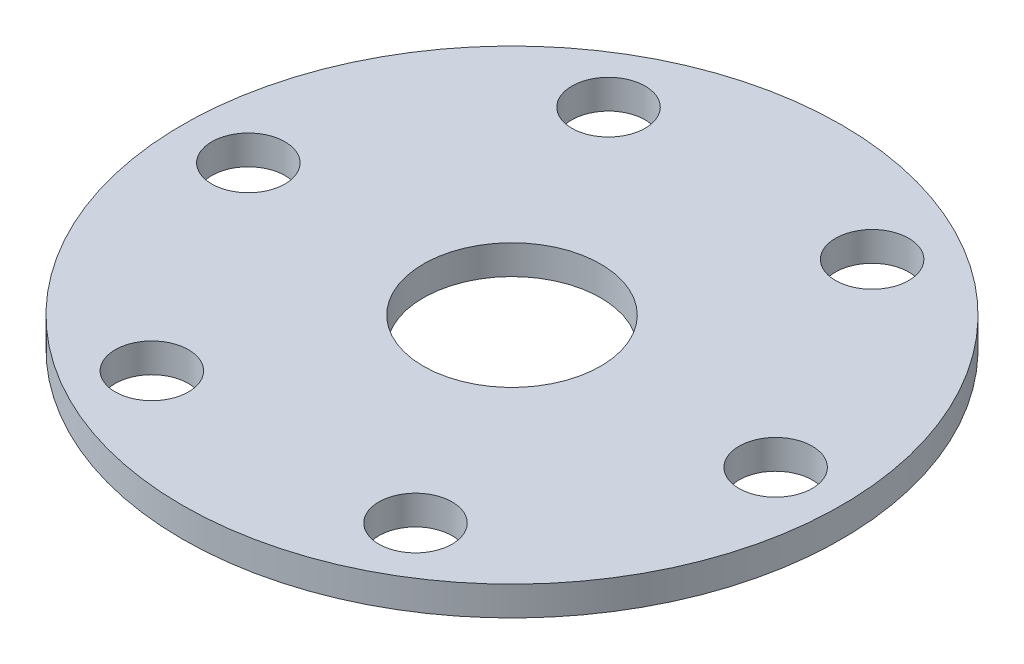
ISO-10303-21;
HEADER;
FILE_DESCRIPTION(('STEP AP214'),'2;1');
FILE_NAME('part.step','',(''),(''),'','','');
FILE_SCHEMA(('AUTOMOTIVE_DESIGN { 1 0 10303 214 1 1 1 1 }'));
ENDSEC;
DATA;
#1=APPLICATION_CONTEXT('core data for automotive mechanical design processes');
#2=APPLICATION_PROTOCOL_DEFINITION('international standard','automotive_design',2000,#1);
#3=PRODUCT_CONTEXT('',#1,'mechanical');
#4=PRODUCT('Part','Part','',(#3));
#5=PRODUCT_RELATED_PRODUCT_CATEGORY('part','',(#4));
#6=PRODUCT_DEFINITION_FORMATION('','',#4);
#7=PRODUCT_DEFINITION_CONTEXT('part definition',#1,'design');
#8=PRODUCT_DEFINITION('design','',#6,#7);
#9=PRODUCT_DEFINITION_SHAPE('','',#8);
#10=(LENGTH_UNIT() NAMED_UNIT(*) SI_UNIT(.MILLI.,.METRE.));
#11=(NAMED_UNIT(*) PLANE_ANGLE_UNIT() SI_UNIT($,.RADIAN.));
#12=(NAMED_UNIT(*) SI_UNIT($,.STERADIAN.) SOLID_ANGLE_UNIT());
#13=UNCERTAINTY_MEASURE_WITH_UNIT(LENGTH_MEASURE(1.E-05),#10,'distance_accuracy_value','');
#14=(GEOMETRIC_REPRESENTATION_CONTEXT(3) GLOBAL_UNCERTAINTY_ASSIGNED_CONTEXT((#13)) GLOBAL_UNIT_ASSIGNED_CONTEXT((#10,
#11,#12)) REPRESENTATION_CONTEXT('',''));
#15=CARTESIAN_POINT('',(0.,0.,0.));
#16=DIRECTION('',(0.,0.,1.));
#17=DIRECTION('',(1.,0.,0.));
#18=AXIS2_PLACEMENT_3D('',#15,#16,#17);
#19=CARTESIAN_POINT('',(0.,2.,0.));
#20=DIRECTION('',(0.,1.,0.));
#21=DIRECTION('',(0.,0.,1.));
#22=AXIS2_PLACEMENT_3D('',#19,#20,#21);
#23=PLANE('',#22);
#24=CARTESIAN_POINT('',(0.,2.,0.));
#25=DIRECTION('',(0.,1.,0.));
#26=DIRECTION('',(0.,0.,1.));
#27=AXIS2_PLACEMENT_3D('',#24,#25,#26);
#28=CIRCLE('',#27,6.05);
#29=CARTESIAN_POINT('',(0.,2.,6.05));
#30=VERTEX_POINT('',#29);
#31=EDGE_CURVE('E94',#30,#30,#28,.T.);
#32=ORIENTED_EDGE('',*,*,#31,.F.);
#33=EDGE_LOOP('',(#32));
#34=FACE_BOUND('',#33,.T.);
#35=CARTESIAN_POINT('',(8.99999999999985,2.,15.58845726812));
#36=DIRECTION('',(0.,1.,0.));
#37=DIRECTION('',(0.,0.,1.));
#38=AXIS2_PLACEMENT_3D('',#35,#36,#37);
#39=CIRCLE('',#38,2.5);
#40=CARTESIAN_POINT('',(8.99999999999985,2.,18.08845726812));
#41=VERTEX_POINT('',#40);
#42=EDGE_CURVE('E77',#41,#41,#39,.T.);
#43=ORIENTED_EDGE('',*,*,#42,.F.);
#44=EDGE_LOOP('',(#43));
#45=FACE_BOUND('',#44,.T.);
#46=CARTESIAN_POINT('',(9.00000000000007,2.,-15.5884572681199));
#47=DIRECTION('',(0.,1.,0.));
#48=DIRECTION('',(0.,0.,1.));
#49=AXIS2_PLACEMENT_3D('',#46,#47,#48);
#50=CIRCLE('',#49,2.5);
#51=CARTESIAN_POINT('',(9.00000000000007,2.,-13.0884572681199));
#52=VERTEX_POINT('',#51);
#53=EDGE_CURVE('E65',#52,#52,#50,.T.);
#54=ORIENTED_EDGE('',*,*,#53,.F.);
#55=EDGE_LOOP('',(#54));
#56=FACE_BOUND('',#55,.T.);
#57=CARTESIAN_POINT('',(-18.,2.,0.));
#58=DIRECTION('',(0.,1.,0.));
#59=DIRECTION('',(0.,0.,1.));
#60=AXIS2_PLACEMENT_3D('',#57,#58,#59);
#61=CIRCLE('',#60,2.5);
#62=CARTESIAN_POINT('',(-18.,2.,2.5));
#63=VERTEX_POINT('',#62);
#64=EDGE_CURVE('E54',#63,#63,#61,.T.);
#65=ORIENTED_EDGE('',*,*,#64,.F.);
#66=EDGE_LOOP('',(#65));
#67=FACE_BOUND('',#66,.T.);
#68=CARTESIAN_POINT('',(0.,2.,0.));
#69=DIRECTION('',(0.,1.,0.));
#70=DIRECTION('',(0.,0.,1.));
#71=AXIS2_PLACEMENT_3D('',#68,#69,#70);
#72=CIRCLE('',#71,22.5);
#73=CARTESIAN_POINT('',(0.,2.,22.5));
#74=VERTEX_POINT('',#73);
#75=EDGE_CURVE('E12',#74,#74,#72,.T.);
#76=ORIENTED_EDGE('',*,*,#75,.T.);
#77=EDGE_LOOP('',(#76));
#78=FACE_BOUND('',#77,.T.);
#79=CARTESIAN_POINT('',(-8.99999999999996,2.,-15.5884572681199));
#80=DIRECTION('',(0.,1.,0.));
#81=DIRECTION('',(0.,0.,1.));
#82=AXIS2_PLACEMENT_3D('',#79,#80,#81);
#83=CIRCLE('',#82,2.5);
#84=CARTESIAN_POINT('',(-8.99999999999996,2.,-13.0884572681199));
#85=VERTEX_POINT('',#84);
#86=EDGE_CURVE('E59',#85,#85,#83,.T.);
#87=ORIENTED_EDGE('',*,*,#86,.F.);
#88=EDGE_LOOP('',(#87));
#89=FACE_BOUND('',#88,.T.);
#90=CARTESIAN_POINT('',(18.,2.,1.23488963959888E-13));
#91=DIRECTION('',(0.,1.,0.));
#92=DIRECTION('',(0.,0.,1.));
#93=AXIS2_PLACEMENT_3D('',#90,#91,#92);
#94=CIRCLE('',#93,2.5);
#95=CARTESIAN_POINT('',(18.,2.,2.50000000000012));
#96=VERTEX_POINT('',#95);
#97=EDGE_CURVE('E71',#96,#96,#94,.T.);
#98=ORIENTED_EDGE('',*,*,#97,.F.);
#99=EDGE_LOOP('',(#98));
#100=FACE_BOUND('',#99,.T.);
#101=CARTESIAN_POINT('',(-9.00000000000018,2.,15.5884572681198));
#102=DIRECTION('',(0.,1.,0.));
#103=DIRECTION('',(0.,0.,1.));
#104=AXIS2_PLACEMENT_3D('',#101,#102,#103);
#105=CIRCLE('',#104,2.5);
#106=CARTESIAN_POINT('',(-9.00000000000018,2.,18.0884572681198));
#107=VERTEX_POINT('',#106);
#108=EDGE_CURVE('E83',#107,#107,#105,.T.);
#109=ORIENTED_EDGE('',*,*,#108,.F.);
#110=EDGE_LOOP('',(#109));
#111=FACE_BOUND('',#110,.T.);
#112=ADVANCED_FACE('F43',(#34,#45,#56,#67,#78,#89,#100,#111),#23,.T.);
#113=CARTESIAN_POINT('',(0.,0.,0.));
#114=DIRECTION('',(0.,1.,0.));
#115=DIRECTION('',(0.,0.,1.));
#116=AXIS2_PLACEMENT_3D('',#113,#114,#115);
#117=PLANE('',#116);
#118=CARTESIAN_POINT('',(0.,0.,0.));
#119=DIRECTION('',(0.,1.,0.));
#120=DIRECTION('',(0.,0.,1.));
#121=AXIS2_PLACEMENT_3D('',#118,#119,#120);
#122=CIRCLE('',#121,6.05);
#123=CARTESIAN_POINT('',(0.,0.,6.05));
#124=VERTEX_POINT('',#123);
#125=EDGE_CURVE('E89',#124,#124,#122,.F.);
#126=ORIENTED_EDGE('',*,*,#125,.F.);
#127=EDGE_LOOP('',(#126));
#128=FACE_BOUND('',#127,.T.);
#129=CARTESIAN_POINT('',(0.,0.,0.));
#130=DIRECTION('',(0.,1.,0.));
#131=DIRECTION('',(0.,0.,1.));
#132=AXIS2_PLACEMENT_3D('',#129,#130,#131);
#133=CIRCLE('',#132,22.5);
#134=CARTESIAN_POINT('',(0.,0.,22.5));
#135=VERTEX_POINT('',#134);
#136=EDGE_CURVE('E47',#135,#135,#133,.T.);
#137=ORIENTED_EDGE('',*,*,#136,.F.);
#138=EDGE_LOOP('',(#137));
#139=FACE_BOUND('',#138,.T.);
#140=CARTESIAN_POINT('',(-18.,0.,0.));
#141=DIRECTION('',(0.,1.,0.));
#142=DIRECTION('',(0.,0.,1.));
#143=AXIS2_PLACEMENT_3D('',#140,#141,#142);
#144=CIRCLE('',#143,2.5);
#145=CARTESIAN_POINT('',(-18.,0.,2.5));
#146=VERTEX_POINT('',#145);
#147=EDGE_CURVE('E56',#146,#146,#144,.T.);
#148=ORIENTED_EDGE('',*,*,#147,.T.);
#149=EDGE_LOOP('',(#148));
#150=FACE_BOUND('',#149,.T.);
#151=CARTESIAN_POINT('',(-8.99999999999996,0.,-15.5884572681199));
#152=DIRECTION('',(0.,1.,0.));
#153=DIRECTION('',(0.,0.,1.));
#154=AXIS2_PLACEMENT_3D('',#151,#152,#153);
#155=CIRCLE('',#154,2.5);
#156=CARTESIAN_POINT('',(-8.99999999999996,0.,-13.0884572681199));
#157=VERTEX_POINT('',#156);
#158=EDGE_CURVE('E62',#157,#157,#155,.T.);
#159=ORIENTED_EDGE('',*,*,#158,.T.);
#160=EDGE_LOOP('',(#159));
#161=FACE_BOUND('',#160,.T.);
#162=CARTESIAN_POINT('',(9.00000000000007,0.,-15.5884572681199));
#163=DIRECTION('',(0.,1.,0.));
#164=DIRECTION('',(0.,0.,1.));
#165=AXIS2_PLACEMENT_3D('',#162,#163,#164);
#166=CIRCLE('',#165,2.5);
#167=CARTESIAN_POINT('',(9.00000000000007,0.,-13.0884572681199));
#168=VERTEX_POINT('',#167);
#169=EDGE_CURVE('E68',#168,#168,#166,.T.);
#170=ORIENTED_EDGE('',*,*,#169,.T.);
#171=EDGE_LOOP('',(#170));
#172=FACE_BOUND('',#171,.T.);
#173=CARTESIAN_POINT('',(18.,0.,1.23488963959888E-13));
#174=DIRECTION('',(0.,1.,0.));
#175=DIRECTION('',(0.,0.,1.));
#176=AXIS2_PLACEMENT_3D('',#173,#174,#175);
#177=CIRCLE('',#176,2.5);
#178=CARTESIAN_POINT('',(18.,0.,2.50000000000012));
#179=VERTEX_POINT('',#178);
#180=EDGE_CURVE('E74',#179,#179,#177,.T.);
#181=ORIENTED_EDGE('',*,*,#180,.T.);
#182=EDGE_LOOP('',(#181));
#183=FACE_BOUND('',#182,.T.);
#184=CARTESIAN_POINT('',(8.99999999999985,0.,15.58845726812));
#185=DIRECTION('',(0.,1.,0.));
#186=DIRECTION('',(0.,0.,1.));
#187=AXIS2_PLACEMENT_3D('',#184,#185,#186);
#188=CIRCLE('',#187,2.5);
#189=CARTESIAN_POINT('',(8.99999999999985,0.,18.08845726812));
#190=VERTEX_POINT('',#189);
#191=EDGE_CURVE('E80',#190,#190,#188,.T.);
#192=ORIENTED_EDGE('',*,*,#191,.T.);
#193=EDGE_LOOP('',(#192));
#194=FACE_BOUND('',#193,.T.);
#195=CARTESIAN_POINT('',(-9.00000000000018,0.,15.5884572681198));
#196=DIRECTION('',(0.,1.,0.));
#197=DIRECTION('',(0.,0.,1.));
#198=AXIS2_PLACEMENT_3D('',#195,#196,#197);
#199=CIRCLE('',#198,2.5);
#200=CARTESIAN_POINT('',(-9.00000000000018,0.,18.0884572681198));
#201=VERTEX_POINT('',#200);
#202=EDGE_CURVE('E86',#201,#201,#199,.T.);
#203=ORIENTED_EDGE('',*,*,#202,.T.);
#204=EDGE_LOOP('',(#203));
#205=FACE_BOUND('',#204,.T.);
#206=ADVANCED_FACE('F103',(#128,#139,#150,#161,#172,#183,#194,#205),#117,.F.);
#207=CARTESIAN_POINT('',(0.,2.,0.));
#208=DIRECTION('',(0.,-1.,0.));
#209=DIRECTION('',(0.,0.,-1.));
#210=AXIS2_PLACEMENT_3D('',#207,#208,#209);
#211=CYLINDRICAL_SURFACE('',#210,22.5);
#212=ORIENTED_EDGE('',*,*,#75,.F.);
#213=EDGE_LOOP('',(#212));
#214=FACE_BOUND('',#213,.T.);
#215=ORIENTED_EDGE('',*,*,#136,.T.);
#216=EDGE_LOOP('',(#215));
#217=FACE_BOUND('',#216,.T.);
#218=ADVANCED_FACE('F45',(#214,#217),#211,.T.);
#219=CARTESIAN_POINT('',(-18.,2.,0.));
#220=DIRECTION('',(0.,-1.,0.));
#221=DIRECTION('',(0.,0.,-1.));
#222=AXIS2_PLACEMENT_3D('',#219,#220,#221);
#223=CYLINDRICAL_SURFACE('',#222,2.5);
#224=ORIENTED_EDGE('',*,*,#64,.T.);
#225=EDGE_LOOP('',(#224));
#226=FACE_BOUND('',#225,.T.);
#227=ORIENTED_EDGE('',*,*,#147,.F.);
#228=EDGE_LOOP('',(#227));
#229=FACE_BOUND('',#228,.T.);
#230=ADVANCED_FACE('F129',(#226,#229),#223,.F.);
#231=CARTESIAN_POINT('',(-8.99999999999996,2.,-15.5884572681199));
#232=DIRECTION('',(0.,-1.,0.));
#233=DIRECTION('',(0.,0.,-1.));
#234=AXIS2_PLACEMENT_3D('',#231,#232,#233);
#235=CYLINDRICAL_SURFACE('',#234,2.5);
#236=ORIENTED_EDGE('',*,*,#86,.T.);
#237=EDGE_LOOP('',(#236));
#238=FACE_BOUND('',#237,.T.);
#239=ORIENTED_EDGE('',*,*,#158,.F.);
#240=EDGE_LOOP('',(#239));
#241=FACE_BOUND('',#240,.T.);
#242=ADVANCED_FACE('F136',(#238,#241),#235,.F.);
#243=CARTESIAN_POINT('',(9.00000000000007,2.,-15.5884572681199));
#244=DIRECTION('',(0.,-1.,0.));
#245=DIRECTION('',(0.,0.,-1.));
#246=AXIS2_PLACEMENT_3D('',#243,#244,#245);
#247=CYLINDRICAL_SURFACE('',#246,2.5);
#248=ORIENTED_EDGE('',*,*,#53,.T.);
#249=EDGE_LOOP('',(#248));
#250=FACE_BOUND('',#249,.T.);
#251=ORIENTED_EDGE('',*,*,#169,.F.);
#252=EDGE_LOOP('',(#251));
#253=FACE_BOUND('',#252,.T.);
#254=ADVANCED_FACE('F140',(#250,#253),#247,.F.);
#255=CARTESIAN_POINT('',(18.,2.,1.23488963959888E-13));
#256=DIRECTION('',(0.,-1.,0.));
#257=DIRECTION('',(0.,0.,-1.));
#258=AXIS2_PLACEMENT_3D('',#255,#256,#257);
#259=CYLINDRICAL_SURFACE('',#258,2.5);
#260=ORIENTED_EDGE('',*,*,#97,.T.);
#261=EDGE_LOOP('',(#260));
#262=FACE_BOUND('',#261,.T.);
#263=ORIENTED_EDGE('',*,*,#180,.F.);
#264=EDGE_LOOP('',(#263));
#265=FACE_BOUND('',#264,.T.);
#266=ADVANCED_FACE('F144',(#262,#265),#259,.F.);
#267=CARTESIAN_POINT('',(8.99999999999985,2.,15.58845726812));
#268=DIRECTION('',(0.,-1.,0.));
#269=DIRECTION('',(0.,0.,-1.));
#270=AXIS2_PLACEMENT_3D('',#267,#268,#269);
#271=CYLINDRICAL_SURFACE('',#270,2.5);
#272=ORIENTED_EDGE('',*,*,#42,.T.);
#273=EDGE_LOOP('',(#272));
#274=FACE_BOUND('',#273,.T.);
#275=ORIENTED_EDGE('',*,*,#191,.F.);
#276=EDGE_LOOP('',(#275));
#277=FACE_BOUND('',#276,.T.);
#278=ADVANCED_FACE('F120',(#274,#277),#271,.F.);
#279=CARTESIAN_POINT('',(-9.00000000000018,2.,15.5884572681198));
#280=DIRECTION('',(0.,-1.,0.));
#281=DIRECTION('',(0.,0.,-1.));
#282=AXIS2_PLACEMENT_3D('',#279,#280,#281);
#283=CYLINDRICAL_SURFACE('',#282,2.5);
#284=ORIENTED_EDGE('',*,*,#108,.T.);
#285=EDGE_LOOP('',(#284));
#286=FACE_BOUND('',#285,.T.);
#287=ORIENTED_EDGE('',*,*,#202,.F.);
#288=EDGE_LOOP('',(#287));
#289=FACE_BOUND('',#288,.T.);
#290=ADVANCED_FACE('F117',(#286,#289),#283,.F.);
#291=CARTESIAN_POINT('',(0.,-0.00100000000000013,0.));
#292=DIRECTION('',(0.,1.,0.));
#293=DIRECTION('',(0.,0.,1.));
#294=AXIS2_PLACEMENT_3D('',#291,#292,#293);
#295=CYLINDRICAL_SURFACE('',#294,6.05);
#296=ORIENTED_EDGE('',*,*,#31,.T.);
#297=EDGE_LOOP('',(#296));
#298=FACE_BOUND('',#297,.T.);
#299=ORIENTED_EDGE('',*,*,#125,.T.);
#300=EDGE_LOOP('',(#299));
#301=FACE_BOUND('',#300,.T.);
#302=ADVANCED_FACE('F98',(#298,#301),#295,.F.);
#303=CLOSED_SHELL('',(#112,#206,#218,#230,#242,#254,#266,#278,#290,#302));
#304=MANIFOLD_SOLID_BREP('B2',#303);
#305=ADVANCED_BREP_SHAPE_REPRESENTATION('',(#18,#304),#14);
#306=SHAPE_DEFINITION_REPRESENTATION(#9,#305);
ENDSEC;
END-ISO-10303-21;
